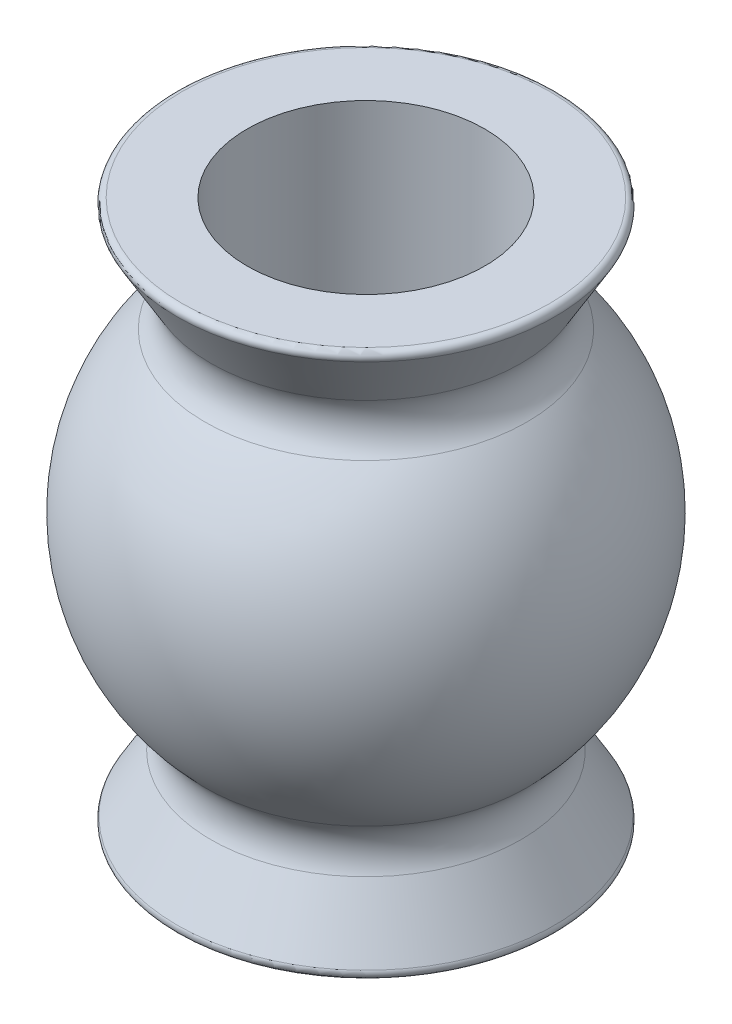
ISO-10303-21;
HEADER;
FILE_DESCRIPTION(('STEP AP214'),'2;1');
FILE_NAME('part.step','',(''),(''),'','','');
FILE_SCHEMA(('AUTOMOTIVE_DESIGN { 1 0 10303 214 1 1 1 1 }'));
ENDSEC;
DATA;
#1=APPLICATION_CONTEXT('core data for automotive mechanical design processes');
#2=APPLICATION_PROTOCOL_DEFINITION('international standard','automotive_design',2000,#1);
#3=PRODUCT_CONTEXT('',#1,'mechanical');
#4=PRODUCT('Part','Part','',(#3));
#5=PRODUCT_RELATED_PRODUCT_CATEGORY('part','',(#4));
#6=PRODUCT_DEFINITION_FORMATION('','',#4);
#7=PRODUCT_DEFINITION_CONTEXT('part definition',#1,'design');
#8=PRODUCT_DEFINITION('design','',#6,#7);
#9=PRODUCT_DEFINITION_SHAPE('','',#8);
#10=(LENGTH_UNIT() NAMED_UNIT(*) SI_UNIT(.MILLI.,.METRE.));
#11=(NAMED_UNIT(*) PLANE_ANGLE_UNIT() SI_UNIT($,.RADIAN.));
#12=(NAMED_UNIT(*) SI_UNIT($,.STERADIAN.) SOLID_ANGLE_UNIT());
#13=UNCERTAINTY_MEASURE_WITH_UNIT(LENGTH_MEASURE(1.E-05),#10,'distance_accuracy_value','');
#14=(GEOMETRIC_REPRESENTATION_CONTEXT(3) GLOBAL_UNCERTAINTY_ASSIGNED_CONTEXT((#13)) GLOBAL_UNIT_ASSIGNED_CONTEXT((#10,
#11,#12)) REPRESENTATION_CONTEXT('',''));
#15=CARTESIAN_POINT('',(0.,0.,0.));
#16=DIRECTION('',(0.,0.,1.));
#17=DIRECTION('',(1.,0.,0.));
#18=AXIS2_PLACEMENT_3D('',#15,#16,#17);
#19=CARTESIAN_POINT('',(2.4892,0.,0.));
#20=DIRECTION('',(0.,-1.,0.));
#21=DIRECTION('',(0.,0.,-1.));
#22=AXIS2_PLACEMENT_3D('',#19,#20,#21);
#23=PLANE('',#22);
#24=CARTESIAN_POINT('',(0.,0.,0.));
#25=DIRECTION('',(0.,-1.,0.));
#26=DIRECTION('',(0.,0.,-1.));
#27=AXIS2_PLACEMENT_3D('',#24,#25,#26);
#28=CIRCLE('',#27,2.35575927111134);
#29=CARTESIAN_POINT('',(0.,0.,-2.35575927111134));
#30=VERTEX_POINT('',#29);
#31=EDGE_CURVE('E56',#30,#30,#28,.T.);
#32=ORIENTED_EDGE('',*,*,#31,.T.);
#33=EDGE_LOOP('',(#32));
#34=FACE_BOUND('',#33,.T.);
#35=CARTESIAN_POINT('',(0.,0.,0.));
#36=DIRECTION('',(0.,-1.,0.));
#37=DIRECTION('',(0.,0.,-1.));
#38=AXIS2_PLACEMENT_3D('',#35,#36,#37);
#39=CIRCLE('',#38,1.524);
#40=CARTESIAN_POINT('',(0.,0.,-1.524));
#41=VERTEX_POINT('',#40);
#42=EDGE_CURVE('E73',#41,#41,#39,.T.);
#43=ORIENTED_EDGE('',*,*,#42,.F.);
#44=EDGE_LOOP('',(#43));
#45=FACE_BOUND('',#44,.T.);
#46=ADVANCED_FACE('F41',(#34,#45),#23,.T.);
#47=CARTESIAN_POINT('',(0.,0.,0.));
#48=DIRECTION('',(0.,-1.,0.));
#49=DIRECTION('',(0.,0.,-1.));
#50=AXIS2_PLACEMENT_3D('',#47,#48,#49);
#51=CYLINDRICAL_SURFACE('',#50,1.524);
#52=ORIENTED_EDGE('',*,*,#42,.T.);
#53=EDGE_LOOP('',(#52));
#54=FACE_BOUND('',#53,.T.);
#55=CARTESIAN_POINT('',(0.,6.985,0.));
#56=DIRECTION('',(0.,-1.,0.));
#57=DIRECTION('',(0.,0.,-1.));
#58=AXIS2_PLACEMENT_3D('',#55,#56,#57);
#59=CIRCLE('',#58,1.524);
#60=CARTESIAN_POINT('',(0.,6.985,-1.524));
#61=VERTEX_POINT('',#60);
#62=EDGE_CURVE('E76',#61,#61,#59,.T.);
#63=ORIENTED_EDGE('',*,*,#62,.F.);
#64=EDGE_LOOP('',(#63));
#65=FACE_BOUND('',#64,.T.);
#66=ADVANCED_FACE('F82',(#54,#65),#51,.F.);
#67=CARTESIAN_POINT('',(1.524,6.985,0.));
#68=DIRECTION('',(0.,1.,0.));
#69=DIRECTION('',(0.,0.,1.));
#70=AXIS2_PLACEMENT_3D('',#67,#68,#69);
#71=PLANE('',#70);
#72=CARTESIAN_POINT('',(0.,6.985,0.));
#73=DIRECTION('',(0.,1.,0.));
#74=DIRECTION('',(0.,0.,1.));
#75=AXIS2_PLACEMENT_3D('',#72,#73,#74);
#76=CIRCLE('',#75,2.35575927111134);
#77=CARTESIAN_POINT('',(0.,6.985,2.35575927111134));
#78=VERTEX_POINT('',#77);
#79=EDGE_CURVE('E10',#78,#78,#76,.T.);
#80=ORIENTED_EDGE('',*,*,#79,.T.);
#81=EDGE_LOOP('',(#80));
#82=FACE_BOUND('',#81,.T.);
#83=ORIENTED_EDGE('',*,*,#62,.T.);
#84=EDGE_LOOP('',(#83));
#85=FACE_BOUND('',#84,.T.);
#86=ADVANCED_FACE('F80',(#82,#85),#71,.T.);
#87=CARTESIAN_POINT('',(0.,5.7785,0.));
#88=DIRECTION('',(0.,1.,0.));
#89=DIRECTION('',(0.,0.,1.));
#90=AXIS2_PLACEMENT_3D('',#87,#88,#89);
#91=CONICAL_SURFACE('',#90,1.77727413754885,0.533089972720094);
#92=CARTESIAN_POINT('',(0.,6.87007539059065,0.));
#93=DIRECTION('',(0.,-1.,0.));
#94=DIRECTION('',(0.,0.,-1.));
#95=AXIS2_PLACEMENT_3D('',#92,#93,#94);
#96=CIRCLE('',#95,2.42138582538698);
#97=CARTESIAN_POINT('',(0.,6.87007539059065,-2.42138582538698));
#98=VERTEX_POINT('',#97);
#99=EDGE_CURVE('E48',#98,#98,#96,.T.);
#100=ORIENTED_EDGE('',*,*,#99,.T.);
#101=EDGE_LOOP('',(#100));
#102=FACE_BOUND('',#101,.T.);
#103=CARTESIAN_POINT('',(0.,6.1373710390865,0.));
#104=DIRECTION('',(0.,1.,0.));
#105=DIRECTION('',(0.,0.,1.));
#106=AXIS2_PLACEMENT_3D('',#103,#104,#105);
#107=CIRCLE('',#106,1.98903507746629);
#108=CARTESIAN_POINT('',(0.,6.1373710390865,1.98903507746629));
#109=VERTEX_POINT('',#108);
#110=EDGE_CURVE('E61',#109,#109,#107,.T.);
#111=ORIENTED_EDGE('',*,*,#110,.T.);
#112=EDGE_LOOP('',(#111));
#113=FACE_BOUND('',#112,.T.);
#114=ADVANCED_FACE('F90',(#102,#113),#91,.T.);
#115=CARTESIAN_POINT('',(0.,3.4925,0.));
#116=DIRECTION('',(0.,-1.,0.));
#117=DIRECTION('',(1.,0.,0.));
#118=AXIS2_PLACEMENT_3D('',#115,#116,#117);
#119=SPHERICAL_SURFACE('',#118,2.8956);
#120=CARTESIAN_POINT('',(0.,1.46201794548691,0.));
#121=DIRECTION('',(0.,1.,0.));
#122=DIRECTION('',(0.,0.,1.));
#123=AXIS2_PLACEMENT_3D('',#120,#121,#122);
#124=CIRCLE('',#123,2.06437447821375);
#125=CARTESIAN_POINT('',(2.06437447821375,1.46201794548691,0.));
#126=VERTEX_POINT('',#125);
#127=EDGE_CURVE('E64',#126,#126,#124,.T.);
#128=CARTESIAN_POINT('',(0.,5.52298205451309,0.));
#129=DIRECTION('',(0.,-1.,0.));
#130=DIRECTION('',(0.,0.,-1.));
#131=AXIS2_PLACEMENT_3D('',#128,#129,#130);
#132=CIRCLE('',#131,2.06437447821375);
#133=CARTESIAN_POINT('',(2.06437447821375,5.52298205451309,0.));
#134=VERTEX_POINT('',#133);
#135=EDGE_CURVE('E67',#134,#134,#132,.T.);
#136=CARTESIAN_POINT('',(2.06437447821375,1.46201794548691,0.));
#137=CARTESIAN_POINT('',(2.097248765785,1.49543959066228,0.));
#138=CARTESIAN_POINT('',(2.12930998545263,1.52966084121535,0.));
#139=CARTESIAN_POINT('',(2.19173382935683,1.59961901975784,0.));
#140=CARTESIAN_POINT('',(2.2220964535934,1.63535594774726,0.));
#141=CARTESIAN_POINT('',(2.28105064701165,1.70826194784343,0.));
#142=CARTESIAN_POINT('',(2.30964221619333,1.74543101995017,0.));
#143=CARTESIAN_POINT('',(2.3649870905539,1.82111343923906,0.));
#144=CARTESIAN_POINT('',(2.39174039573279,1.85962678642121,0.));
#145=CARTESIAN_POINT('',(2.44334558121302,1.93790697288824,0.));
#146=CARTESIAN_POINT('',(2.46819746151435,1.97767381217312,0.));
#147=CARTESIAN_POINT('',(2.51594119811977,2.05836717462568,0.));
#148=CARTESIAN_POINT('',(2.53883305442387,2.09929369779336,0.));
#149=CARTESIAN_POINT('',(2.58260274615745,2.18220990299986,0.));
#150=CARTESIAN_POINT('',(2.60348058158693,2.22419958503869,0.));
#151=CARTESIAN_POINT('',(2.64317299047784,2.30914307048187,0.));
#152=CARTESIAN_POINT('',(2.66198756393926,2.35209687388621,0.));
#153=CARTESIAN_POINT('',(2.69750907270782,2.4388672919104,0.));
#154=CARTESIAN_POINT('',(2.71421600801496,2.48268390653024,0.));
#155=CARTESIAN_POINT('',(2.74548283574117,2.57107660146261,0.));
#156=CARTESIAN_POINT('',(2.76004272816025,2.61565268177514,0.));
#157=CARTESIAN_POINT('',(2.78698112926495,2.70545917139656,0.));
#158=CARTESIAN_POINT('',(2.79935963795056,2.75068958070545,0.));
#159=CARTESIAN_POINT('',(2.82190607576225,2.8416980483037,0.));
#160=CARTESIAN_POINT('',(2.83207400488832,2.88747610659306,0.));
#161=CARTESIAN_POINT('',(2.85017530159897,2.97947190046354,0.));
#162=CARTESIAN_POINT('',(2.85810866918355,3.02568963604466,0.));
#163=CARTESIAN_POINT('',(2.8717221312468,3.11845577578946,0.));
#164=CARTESIAN_POINT('',(2.87740222572547,3.16500417995314,0.));
#165=CARTESIAN_POINT('',(2.88649574456031,3.25832186824261,0.));
#166=CARTESIAN_POINT('',(2.88990916891648,3.3050911523684,0.));
#167=CARTESIAN_POINT('',(2.89446129663632,3.39874029099612,0.));
#168=CARTESIAN_POINT('',(2.8956,3.44562014549806,0.));
#169=CARTESIAN_POINT('',(2.8956,3.53937985450194,0.));
#170=CARTESIAN_POINT('',(2.89446129663632,3.58625970900388,0.));
#171=CARTESIAN_POINT('',(2.88990916891648,3.6799088476316,0.));
#172=CARTESIAN_POINT('',(2.88649574456031,3.72667813175739,0.));
#173=CARTESIAN_POINT('',(2.87740222572547,3.81999582004686,0.));
#174=CARTESIAN_POINT('',(2.8717221312468,3.86654422421054,0.));
#175=CARTESIAN_POINT('',(2.85810866918355,3.95931036395534,0.));
#176=CARTESIAN_POINT('',(2.85017530159897,4.00552809953646,0.));
#177=CARTESIAN_POINT('',(2.83207400488832,4.09752389340693,0.));
#178=CARTESIAN_POINT('',(2.82190607576225,4.1433019516963,0.));
#179=CARTESIAN_POINT('',(2.79935963795056,4.23431041929455,0.));
#180=CARTESIAN_POINT('',(2.78698112926495,4.27954082860344,0.));
#181=CARTESIAN_POINT('',(2.76004272816025,4.36934731822486,0.));
#182=CARTESIAN_POINT('',(2.74548283574117,4.41392339853739,0.));
#183=CARTESIAN_POINT('',(2.71421600801496,4.50231609346976,0.));
#184=CARTESIAN_POINT('',(2.69750907270782,4.5461327080896,0.));
#185=CARTESIAN_POINT('',(2.66198756393926,4.63290312611378,0.));
#186=CARTESIAN_POINT('',(2.64317299047784,4.67585692951813,0.));
#187=CARTESIAN_POINT('',(2.60348058158693,4.76080041496131,0.));
#188=CARTESIAN_POINT('',(2.58260274615745,4.80279009700014,0.));
#189=CARTESIAN_POINT('',(2.53883305442387,4.88570630220664,0.));
#190=CARTESIAN_POINT('',(2.51594119811977,4.92663282537432,0.));
#191=CARTESIAN_POINT('',(2.46819746151435,5.00732618782688,0.));
#192=CARTESIAN_POINT('',(2.44334558121302,5.04709302711176,0.));
#193=CARTESIAN_POINT('',(2.39174039573279,5.12537321357879,0.));
#194=CARTESIAN_POINT('',(2.3649870905539,5.16388656076094,0.));
#195=CARTESIAN_POINT('',(2.30964221619333,5.23956898004983,0.));
#196=CARTESIAN_POINT('',(2.28105064701165,5.27673805215657,0.));
#197=CARTESIAN_POINT('',(2.2220964535934,5.34964405225274,0.));
#198=CARTESIAN_POINT('',(2.19173382935683,5.38538098024216,0.));
#199=CARTESIAN_POINT('',(2.12930998545263,5.45533915878465,0.));
#200=CARTESIAN_POINT('',(2.097248765785,5.48956040933772,0.));
#201=CARTESIAN_POINT('',(2.06437447821375,5.52298205451309,0.));
#202=B_SPLINE_CURVE_WITH_KNOTS('',3,(#136,#137,#138,#139,#140,#141,#142,#143,#144,#145,#146,
#147,#148,#149,#150,#151,#152,#153,#154,#155,#156,#157,#158,#159,#160,#161,#162,#163,#164,#165,
#166,#167,#168,#169,#170,#171,#172,#173,#174,#175,#176,#177,#178,#179,#180,#181,#182,#183,#184,
#185,#186,#187,#188,#189,#190,#191,#192,#193,#194,#195,#196,#197,#198,#199,#200,#201),
.UNSPECIFIED.,.F.,.F.,(4,2,2,2,2,2,2,2,2,2,2,2,2,2,2,2,2,2,2,2,2,2,2,2,2,2,2,2,2,2,2,2,4),(0.,
0.140625744248025,0.28125148849605,0.421877232744075,0.5625029769921,0.703128721240125,
0.84375446548815,0.984380209736175,1.1250059539842,1.26563169823223,1.40625744248025,
1.54688318672828,1.6875089309763,1.82813467522433,1.96876041947235,2.10938616372038,
2.2500119079684,2.39063765221643,2.53126339646445,2.67188914071248,2.8125148849605,
2.95314062920853,3.09376637345655,3.23439211770458,3.3750178619526,3.51564360620063,
3.65626935044865,3.79689509469668,3.9375208389447,4.07814658319273,4.21877232744075,
4.35939807168878,4.5000238159368),.UNSPECIFIED.);
#203=EDGE_CURVE('BSEAM120',#126,#134,#202,.T.);
#204=ORIENTED_EDGE('',*,*,#127,.T.);
#205=ORIENTED_EDGE('',*,*,#135,.T.);
#206=ORIENTED_EDGE('',*,*,#203,.T.);
#207=ORIENTED_EDGE('',*,*,#203,.F.);
#208=EDGE_LOOP('',(#204,#206,#205,#207));
#209=FACE_BOUND('',#208,.T.);
#210=ADVANCED_FACE('F120',(#209),#119,.T.);
#211=CARTESIAN_POINT('',(0.,0.,0.));
#212=DIRECTION('',(0.,-1.,0.));
#213=DIRECTION('',(0.,0.,-1.));
#214=AXIS2_PLACEMENT_3D('',#211,#212,#213);
#215=CONICAL_SURFACE('',#214,2.4892,0.533089972720094);
#216=CARTESIAN_POINT('',(0.,0.11492460940935,0.));
#217=DIRECTION('',(0.,1.,0.));
#218=DIRECTION('',(0.,0.,1.));
#219=AXIS2_PLACEMENT_3D('',#216,#217,#218);
#220=CIRCLE('',#219,2.42138582538698);
#221=CARTESIAN_POINT('',(0.,0.11492460940935,2.42138582538698));
#222=VERTEX_POINT('',#221);
#223=EDGE_CURVE('E52',#222,#222,#220,.T.);
#224=ORIENTED_EDGE('',*,*,#223,.T.);
#225=EDGE_LOOP('',(#224));
#226=FACE_BOUND('',#225,.T.);
#227=CARTESIAN_POINT('',(0.,0.847628960913503,0.));
#228=DIRECTION('',(0.,-1.,0.));
#229=DIRECTION('',(0.,0.,-1.));
#230=AXIS2_PLACEMENT_3D('',#227,#228,#229);
#231=CIRCLE('',#230,1.98903507746629);
#232=CARTESIAN_POINT('',(0.,0.847628960913503,-1.98903507746629));
#233=VERTEX_POINT('',#232);
#234=EDGE_CURVE('E70',#233,#233,#231,.T.);
#235=ORIENTED_EDGE('',*,*,#234,.T.);
#236=EDGE_LOOP('',(#235));
#237=FACE_BOUND('',#236,.T.);
#238=ADVANCED_FACE('F101',(#226,#237),#215,.T.);
#239=CARTESIAN_POINT('',(0.,1.1057930236425,0.));
#240=DIRECTION('',(0.,1.,0.));
#241=DIRECTION('',(0.,0.,1.));
#242=AXIS2_PLACEMENT_3D('',#239,#240,#241);
#243=TOROIDAL_SURFACE('',#242,2.42654543930388,0.508);
#244=ORIENTED_EDGE('',*,*,#127,.F.);
#245=EDGE_LOOP('',(#244));
#246=FACE_BOUND('',#245,.T.);
#247=ORIENTED_EDGE('',*,*,#234,.F.);
#248=EDGE_LOOP('',(#247));
#249=FACE_BOUND('',#248,.T.);
#250=ADVANCED_FACE('F97',(#246,#249),#243,.F.);
#251=CARTESIAN_POINT('',(0.,5.8792069763575,0.));
#252=DIRECTION('',(0.,-1.,0.));
#253=DIRECTION('',(0.,0.,-1.));
#254=AXIS2_PLACEMENT_3D('',#251,#252,#253);
#255=TOROIDAL_SURFACE('',#254,2.42654543930388,0.508);
#256=ORIENTED_EDGE('',*,*,#110,.F.);
#257=EDGE_LOOP('',(#256));
#258=FACE_BOUND('',#257,.T.);
#259=ORIENTED_EDGE('',*,*,#135,.F.);
#260=EDGE_LOOP('',(#259));
#261=FACE_BOUND('',#260,.T.);
#262=ADVANCED_FACE('F100',(#258,#261),#255,.F.);
#263=CARTESIAN_POINT('',(0.,0.0761999999999999,0.));
#264=DIRECTION('',(0.,-1.,0.));
#265=DIRECTION('',(0.,0.,-1.));
#266=AXIS2_PLACEMENT_3D('',#263,#264,#265);
#267=TOROIDAL_SURFACE('',#266,2.35575927111134,0.0762);
#268=ORIENTED_EDGE('',*,*,#223,.F.);
#269=EDGE_LOOP('',(#268));
#270=FACE_BOUND('',#269,.T.);
#271=ORIENTED_EDGE('',*,*,#31,.F.);
#272=EDGE_LOOP('',(#271));
#273=FACE_BOUND('',#272,.T.);
#274=ADVANCED_FACE('F104',(#270,#273),#267,.T.);
#275=CARTESIAN_POINT('',(0.,6.9088,0.));
#276=DIRECTION('',(0.,1.,0.));
#277=DIRECTION('',(0.,0.,1.));
#278=AXIS2_PLACEMENT_3D('',#275,#276,#277);
#279=TOROIDAL_SURFACE('',#278,2.35575927111134,0.0762);
#280=ORIENTED_EDGE('',*,*,#79,.F.);
#281=EDGE_LOOP('',(#280));
#282=FACE_BOUND('',#281,.T.);
#283=ORIENTED_EDGE('',*,*,#99,.F.);
#284=EDGE_LOOP('',(#283));
#285=FACE_BOUND('',#284,.T.);
#286=ADVANCED_FACE('F43',(#282,#285),#279,.T.);
#287=CLOSED_SHELL('',(#46,#66,#86,#114,#210,#238,#250,#262,#274,#286));
#288=MANIFOLD_SOLID_BREP('B2',#287);
#289=ADVANCED_BREP_SHAPE_REPRESENTATION('',(#18,#288),#14);
#290=SHAPE_DEFINITION_REPRESENTATION(#9,#289);
ENDSEC;
END-ISO-10303-21;
